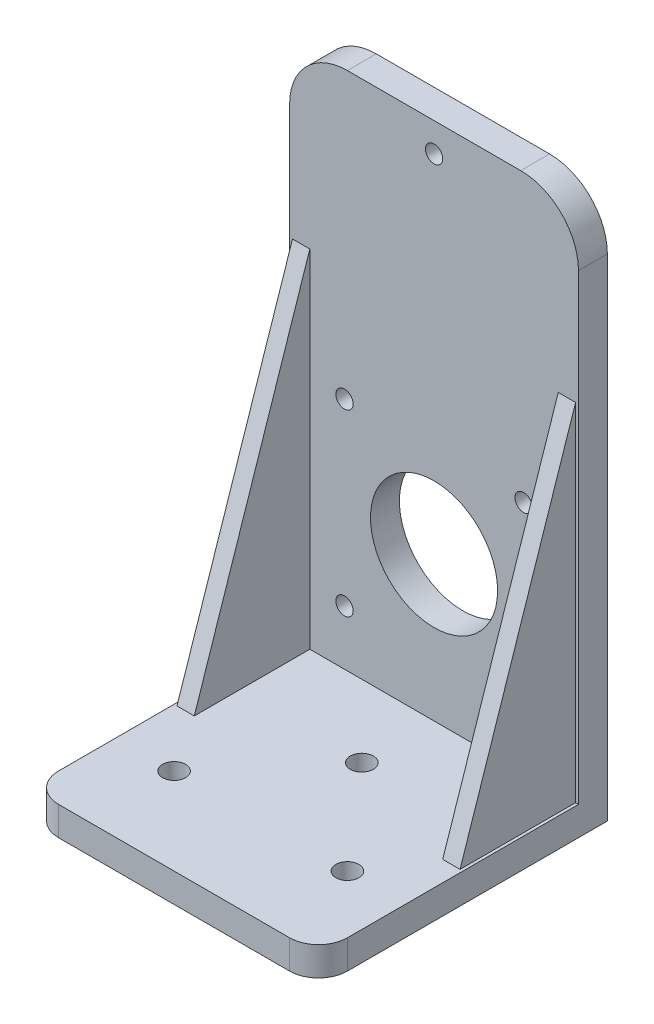
ISO-10303-21;
HEADER;
FILE_DESCRIPTION(('STEP AP214'),'2;1');
FILE_NAME('part.step','',(''),(''),'','','');
FILE_SCHEMA(('AUTOMOTIVE_DESIGN { 1 0 10303 214 1 1 1 1 }'));
ENDSEC;
DATA;
#1=APPLICATION_CONTEXT('core data for automotive mechanical design processes');
#2=APPLICATION_PROTOCOL_DEFINITION('international standard','automotive_design',2000,#1);
#3=PRODUCT_CONTEXT('',#1,'mechanical');
#4=PRODUCT('Part','Part','',(#3));
#5=PRODUCT_RELATED_PRODUCT_CATEGORY('part','',(#4));
#6=PRODUCT_DEFINITION_FORMATION('','',#4);
#7=PRODUCT_DEFINITION_CONTEXT('part definition',#1,'design');
#8=PRODUCT_DEFINITION('design','',#6,#7);
#9=PRODUCT_DEFINITION_SHAPE('','',#8);
#10=(LENGTH_UNIT() NAMED_UNIT(*) SI_UNIT(.MILLI.,.METRE.));
#11=(NAMED_UNIT(*) PLANE_ANGLE_UNIT() SI_UNIT($,.RADIAN.));
#12=(NAMED_UNIT(*) SI_UNIT($,.STERADIAN.) SOLID_ANGLE_UNIT());
#13=UNCERTAINTY_MEASURE_WITH_UNIT(LENGTH_MEASURE(1.E-05),#10,'distance_accuracy_value','');
#14=(GEOMETRIC_REPRESENTATION_CONTEXT(3) GLOBAL_UNCERTAINTY_ASSIGNED_CONTEXT((#13)) GLOBAL_UNIT_ASSIGNED_CONTEXT((#10,
#11,#12)) REPRESENTATION_CONTEXT('',''));
#15=CARTESIAN_POINT('',(0.,0.,0.));
#16=DIRECTION('',(0.,0.,1.));
#17=DIRECTION('',(1.,0.,0.));
#18=AXIS2_PLACEMENT_3D('',#15,#16,#17);
#19=CARTESIAN_POINT('',(-20.,20.,5.));
#20=DIRECTION('',(0.,0.,1.));
#21=DIRECTION('',(1.,0.,0.));
#22=AXIS2_PLACEMENT_3D('',#19,#20,#21);
#23=PLANE('',#22);
#24=DIRECTION('',(0.,-1.,0.));
#25=VECTOR('',#24,1.);
#26=CARTESIAN_POINT('',(21.5,35.,5.));
#27=LINE('',#26,#25);
#28=CARTESIAN_POINT('',(21.5,35.,5.));
#29=VERTEX_POINT('',#28);
#30=CARTESIAN_POINT('',(21.5,-25.,5.));
#31=VERTEX_POINT('',#30);
#32=EDGE_CURVE('E51',#29,#31,#27,.T.);
#33=ORIENTED_EDGE('',*,*,#32,.F.);
#34=DIRECTION('',(1.,0.,0.));
#35=VECTOR('',#34,1.);
#36=CARTESIAN_POINT('',(21.5,35.,5.));
#37=LINE('',#36,#35);
#38=CARTESIAN_POINT('',(24.5,35.,5.));
#39=VERTEX_POINT('',#38);
#40=EDGE_CURVE('E56',#29,#39,#37,.T.);
#41=ORIENTED_EDGE('',*,*,#40,.T.);
#42=DIRECTION('',(0.,-1.,0.));
#43=VECTOR('',#42,1.);
#44=CARTESIAN_POINT('',(24.5,35.,5.));
#45=LINE('',#44,#43);
#46=CARTESIAN_POINT('',(24.5,-25.,5.));
#47=VERTEX_POINT('',#46);
#48=EDGE_CURVE('E161',#39,#47,#45,.T.);
#49=ORIENTED_EDGE('',*,*,#48,.T.);
#50=DIRECTION('',(-1.,0.,0.));
#51=VECTOR('',#50,1.);
#52=CARTESIAN_POINT('',(-25.,-25.,5.));
#53=LINE('',#52,#51);
#54=CARTESIAN_POINT('',(25.,-25.,5.));
#55=VERTEX_POINT('',#54);
#56=EDGE_CURVE('E148',#55,#47,#53,.T.);
#57=ORIENTED_EDGE('',*,*,#56,.F.);
#58=DIRECTION('',(0.,1.,0.));
#59=VECTOR('',#58,1.);
#60=CARTESIAN_POINT('',(25.,20.,5.));
#61=LINE('',#60,#59);
#62=CARTESIAN_POINT('',(25.,55.,5.));
#63=VERTEX_POINT('',#62);
#64=EDGE_CURVE('E284',#55,#63,#61,.T.);
#65=ORIENTED_EDGE('',*,*,#64,.T.);
#66=CARTESIAN_POINT('',(15.,55.,5.));
#67=DIRECTION('',(0.,0.,-1.));
#68=DIRECTION('',(-1.,0.,0.));
#69=AXIS2_PLACEMENT_3D('',#66,#67,#68);
#70=CIRCLE('',#69,10.);
#71=CARTESIAN_POINT('',(15.,65.,5.));
#72=VERTEX_POINT('',#71);
#73=EDGE_CURVE('E214',#63,#72,#70,.F.);
#74=ORIENTED_EDGE('',*,*,#73,.T.);
#75=DIRECTION('',(-1.,0.,0.));
#76=VECTOR('',#75,1.);
#77=CARTESIAN_POINT('',(0.,65.,5.));
#78=LINE('',#77,#76);
#79=CARTESIAN_POINT('',(-15.,65.,5.));
#80=VERTEX_POINT('',#79);
#81=EDGE_CURVE('E212',#72,#80,#78,.T.);
#82=ORIENTED_EDGE('',*,*,#81,.T.);
#83=CARTESIAN_POINT('',(-15.,55.,5.));
#84=DIRECTION('',(0.,0.,-1.));
#85=DIRECTION('',(-1.,0.,0.));
#86=AXIS2_PLACEMENT_3D('',#83,#84,#85);
#87=CIRCLE('',#86,10.);
#88=CARTESIAN_POINT('',(-25.,55.,5.));
#89=VERTEX_POINT('',#88);
#90=EDGE_CURVE('E208',#80,#89,#87,.F.);
#91=ORIENTED_EDGE('',*,*,#90,.T.);
#92=DIRECTION('',(0.,-1.,0.));
#93=VECTOR('',#92,1.);
#94=CARTESIAN_POINT('',(-25.,20.,5.));
#95=LINE('',#94,#93);
#96=CARTESIAN_POINT('',(-25.,-25.,5.));
#97=VERTEX_POINT('',#96);
#98=EDGE_CURVE('E286',#89,#97,#95,.T.);
#99=ORIENTED_EDGE('',*,*,#98,.T.);
#100=CARTESIAN_POINT('',(-24.5,-25.,5.));
#101=VERTEX_POINT('',#100);
#102=EDGE_CURVE('E159',#101,#97,#53,.T.);
#103=ORIENTED_EDGE('',*,*,#102,.F.);
#104=DIRECTION('',(0.,-1.,0.));
#105=VECTOR('',#104,1.);
#106=CARTESIAN_POINT('',(-24.5,35.,5.));
#107=LINE('',#106,#105);
#108=CARTESIAN_POINT('',(-24.5,35.,5.));
#109=VERTEX_POINT('',#108);
#110=EDGE_CURVE('E186',#109,#101,#107,.T.);
#111=ORIENTED_EDGE('',*,*,#110,.F.);
#112=DIRECTION('',(-1.,0.,0.));
#113=VECTOR('',#112,1.);
#114=CARTESIAN_POINT('',(-21.5,35.,5.));
#115=LINE('',#114,#113);
#116=CARTESIAN_POINT('',(-21.5,35.,5.));
#117=VERTEX_POINT('',#116);
#118=EDGE_CURVE('E200',#117,#109,#115,.T.);
#119=ORIENTED_EDGE('',*,*,#118,.F.);
#120=DIRECTION('',(0.,-1.,0.));
#121=VECTOR('',#120,1.);
#122=CARTESIAN_POINT('',(-21.5,35.,5.));
#123=LINE('',#122,#121);
#124=CARTESIAN_POINT('',(-21.5,-25.,5.));
#125=VERTEX_POINT('',#124);
#126=EDGE_CURVE('E189',#117,#125,#123,.T.);
#127=ORIENTED_EDGE('',*,*,#126,.T.);
#128=EDGE_CURVE('E157',#31,#125,#53,.T.);
#129=ORIENTED_EDGE('',*,*,#128,.F.);
#130=EDGE_LOOP('',(#33,#41,#49,#57,#65,#74,#82,#91,#99,#103,#111,#119,#127,#129));
#131=FACE_BOUND('',#130,.T.);
#132=CARTESIAN_POINT('',(-15.5000000000001,-15.5,5.));
#133=DIRECTION('',(0.,0.,1.));
#134=DIRECTION('',(1.,0.,0.));
#135=AXIS2_PLACEMENT_3D('',#132,#133,#134);
#136=CIRCLE('',#135,1.5);
#137=CARTESIAN_POINT('',(-14.0000000000001,-15.5,5.));
#138=VERTEX_POINT('',#137);
#139=EDGE_CURVE('E228',#138,#138,#136,.T.);
#140=ORIENTED_EDGE('',*,*,#139,.F.);
#141=EDGE_LOOP('',(#140));
#142=FACE_BOUND('',#141,.T.);
#143=CARTESIAN_POINT('',(15.4999999999999,-15.5,5.));
#144=DIRECTION('',(0.,0.,1.));
#145=DIRECTION('',(1.,0.,0.));
#146=AXIS2_PLACEMENT_3D('',#143,#144,#145);
#147=CIRCLE('',#146,1.5);
#148=CARTESIAN_POINT('',(16.9999999999999,-15.5,5.));
#149=VERTEX_POINT('',#148);
#150=EDGE_CURVE('E247',#149,#149,#147,.T.);
#151=ORIENTED_EDGE('',*,*,#150,.F.);
#152=EDGE_LOOP('',(#151));
#153=FACE_BOUND('',#152,.T.);
#154=CARTESIAN_POINT('',(15.4999999999999,15.5,5.));
#155=DIRECTION('',(0.,0.,1.));
#156=DIRECTION('',(1.,0.,0.));
#157=AXIS2_PLACEMENT_3D('',#154,#155,#156);
#158=CIRCLE('',#157,1.5);
#159=CARTESIAN_POINT('',(16.9999999999999,15.5,5.));
#160=VERTEX_POINT('',#159);
#161=EDGE_CURVE('E241',#160,#160,#158,.T.);
#162=ORIENTED_EDGE('',*,*,#161,.F.);
#163=EDGE_LOOP('',(#162));
#164=FACE_BOUND('',#163,.T.);
#165=CARTESIAN_POINT('',(-15.5000000000001,15.5,5.));
#166=DIRECTION('',(0.,0.,1.));
#167=DIRECTION('',(1.,0.,0.));
#168=AXIS2_PLACEMENT_3D('',#165,#166,#167);
#169=CIRCLE('',#168,1.5);
#170=CARTESIAN_POINT('',(-14.0000000000001,15.5,5.));
#171=VERTEX_POINT('',#170);
#172=EDGE_CURVE('E240',#171,#171,#169,.T.);
#173=ORIENTED_EDGE('',*,*,#172,.F.);
#174=EDGE_LOOP('',(#173));
#175=FACE_BOUND('',#174,.T.);
#176=CARTESIAN_POINT('',(0.,0.,5.));
#177=DIRECTION('',(0.,0.,1.));
#178=DIRECTION('',(1.,0.,0.));
#179=AXIS2_PLACEMENT_3D('',#176,#177,#178);
#180=CIRCLE('',#179,11.);
#181=CARTESIAN_POINT('',(11.,0.,5.));
#182=VERTEX_POINT('',#181);
#183=EDGE_CURVE('E278',#182,#182,#180,.T.);
#184=ORIENTED_EDGE('',*,*,#183,.F.);
#185=EDGE_LOOP('',(#184));
#186=FACE_BOUND('',#185,.T.);
#187=CARTESIAN_POINT('',(0.,60.,5.));
#188=DIRECTION('',(0.,0.,-1.));
#189=DIRECTION('',(-1.,0.,0.));
#190=AXIS2_PLACEMENT_3D('',#187,#188,#189);
#191=CIRCLE('',#190,1.5);
#192=CARTESIAN_POINT('',(-1.5,60.,5.));
#193=VERTEX_POINT('',#192);
#194=EDGE_CURVE('E205',#193,#193,#191,.T.);
#195=ORIENTED_EDGE('',*,*,#194,.T.);
#196=EDGE_LOOP('',(#195));
#197=FACE_BOUND('',#196,.T.);
#198=ADVANCED_FACE('F36',(#131,#142,#153,#164,#175,#186,#197),#23,.T.);
#199=CARTESIAN_POINT('',(-20.,20.,0.));
#200=DIRECTION('',(0.,0.,1.));
#201=DIRECTION('',(1.,0.,0.));
#202=AXIS2_PLACEMENT_3D('',#199,#200,#201);
#203=PLANE('',#202);
#204=CARTESIAN_POINT('',(-15.5000000000001,-15.5,0.));
#205=DIRECTION('',(0.,0.,1.));
#206=DIRECTION('',(1.,0.,0.));
#207=AXIS2_PLACEMENT_3D('',#204,#205,#206);
#208=CIRCLE('',#207,1.5);
#209=CARTESIAN_POINT('',(-14.0000000000001,-15.5,0.));
#210=VERTEX_POINT('',#209);
#211=EDGE_CURVE('E250',#210,#210,#208,.T.);
#212=ORIENTED_EDGE('',*,*,#211,.T.);
#213=EDGE_LOOP('',(#212));
#214=FACE_BOUND('',#213,.T.);
#215=CARTESIAN_POINT('',(15.4999999999999,-15.5,0.));
#216=DIRECTION('',(0.,0.,1.));
#217=DIRECTION('',(1.,0.,0.));
#218=AXIS2_PLACEMENT_3D('',#215,#216,#217);
#219=CIRCLE('',#218,1.5);
#220=CARTESIAN_POINT('',(16.9999999999999,-15.5,0.));
#221=VERTEX_POINT('',#220);
#222=EDGE_CURVE('E244',#221,#221,#219,.T.);
#223=ORIENTED_EDGE('',*,*,#222,.T.);
#224=EDGE_LOOP('',(#223));
#225=FACE_BOUND('',#224,.T.);
#226=CARTESIAN_POINT('',(15.4999999999999,15.5,0.));
#227=DIRECTION('',(0.,0.,1.));
#228=DIRECTION('',(1.,0.,0.));
#229=AXIS2_PLACEMENT_3D('',#226,#227,#228);
#230=CIRCLE('',#229,1.5);
#231=CARTESIAN_POINT('',(16.9999999999999,15.5,0.));
#232=VERTEX_POINT('',#231);
#233=EDGE_CURVE('E237',#232,#232,#230,.T.);
#234=ORIENTED_EDGE('',*,*,#233,.T.);
#235=EDGE_LOOP('',(#234));
#236=FACE_BOUND('',#235,.T.);
#237=CARTESIAN_POINT('',(-15.5000000000001,15.5,0.));
#238=DIRECTION('',(0.,0.,1.));
#239=DIRECTION('',(1.,0.,0.));
#240=AXIS2_PLACEMENT_3D('',#237,#238,#239);
#241=CIRCLE('',#240,1.5);
#242=CARTESIAN_POINT('',(-14.0000000000001,15.5,0.));
#243=VERTEX_POINT('',#242);
#244=EDGE_CURVE('E255',#243,#243,#241,.T.);
#245=ORIENTED_EDGE('',*,*,#244,.T.);
#246=EDGE_LOOP('',(#245));
#247=FACE_BOUND('',#246,.T.);
#248=DIRECTION('',(0.,1.,0.));
#249=VECTOR('',#248,1.);
#250=CARTESIAN_POINT('',(25.,20.,0.));
#251=LINE('',#250,#249);
#252=CARTESIAN_POINT('',(25.,-30.,0.));
#253=VERTEX_POINT('',#252);
#254=CARTESIAN_POINT('',(25.,55.,0.));
#255=VERTEX_POINT('',#254);
#256=EDGE_CURVE('E281',#253,#255,#251,.T.);
#257=ORIENTED_EDGE('',*,*,#256,.F.);
#258=DIRECTION('',(1.,0.,0.));
#259=VECTOR('',#258,1.);
#260=CARTESIAN_POINT('',(-25.,-30.,0.));
#261=LINE('',#260,#259);
#262=CARTESIAN_POINT('',(-25.,-30.,0.));
#263=VERTEX_POINT('',#262);
#264=EDGE_CURVE('E271',#263,#253,#261,.T.);
#265=ORIENTED_EDGE('',*,*,#264,.F.);
#266=DIRECTION('',(0.,-1.,0.));
#267=VECTOR('',#266,1.);
#268=CARTESIAN_POINT('',(-25.,20.,0.));
#269=LINE('',#268,#267);
#270=CARTESIAN_POINT('',(-25.,55.,0.));
#271=VERTEX_POINT('',#270);
#272=EDGE_CURVE('E287',#271,#263,#269,.T.);
#273=ORIENTED_EDGE('',*,*,#272,.F.);
#274=CARTESIAN_POINT('',(-15.,55.,0.));
#275=DIRECTION('',(0.,0.,-1.));
#276=DIRECTION('',(-1.,0.,0.));
#277=AXIS2_PLACEMENT_3D('',#274,#275,#276);
#278=CIRCLE('',#277,10.);
#279=CARTESIAN_POINT('',(-15.,65.,0.));
#280=VERTEX_POINT('',#279);
#281=EDGE_CURVE('E219',#280,#271,#278,.F.);
#282=ORIENTED_EDGE('',*,*,#281,.F.);
#283=DIRECTION('',(-1.,0.,0.));
#284=VECTOR('',#283,1.);
#285=CARTESIAN_POINT('',(0.,65.,0.));
#286=LINE('',#285,#284);
#287=CARTESIAN_POINT('',(15.,65.,0.));
#288=VERTEX_POINT('',#287);
#289=EDGE_CURVE('E222',#288,#280,#286,.T.);
#290=ORIENTED_EDGE('',*,*,#289,.F.);
#291=CARTESIAN_POINT('',(15.,55.,0.));
#292=DIRECTION('',(0.,0.,-1.));
#293=DIRECTION('',(-1.,0.,0.));
#294=AXIS2_PLACEMENT_3D('',#291,#292,#293);
#295=CIRCLE('',#294,10.);
#296=EDGE_CURVE('E209',#255,#288,#295,.F.);
#297=ORIENTED_EDGE('',*,*,#296,.F.);
#298=EDGE_LOOP('',(#257,#265,#273,#282,#290,#297));
#299=FACE_BOUND('',#298,.T.);
#300=CARTESIAN_POINT('',(0.,0.,0.));
#301=DIRECTION('',(0.,0.,1.));
#302=DIRECTION('',(1.,0.,0.));
#303=AXIS2_PLACEMENT_3D('',#300,#301,#302);
#304=CIRCLE('',#303,11.);
#305=CARTESIAN_POINT('',(11.,0.,0.));
#306=VERTEX_POINT('',#305);
#307=EDGE_CURVE('E277',#306,#306,#304,.T.);
#308=ORIENTED_EDGE('',*,*,#307,.T.);
#309=EDGE_LOOP('',(#308));
#310=FACE_BOUND('',#309,.T.);
#311=CARTESIAN_POINT('',(0.,60.,0.));
#312=DIRECTION('',(0.,0.,-1.));
#313=DIRECTION('',(-1.,0.,0.));
#314=AXIS2_PLACEMENT_3D('',#311,#312,#313);
#315=CIRCLE('',#314,1.5);
#316=CARTESIAN_POINT('',(-1.5,60.,0.));
#317=VERTEX_POINT('',#316);
#318=EDGE_CURVE('E203',#317,#317,#315,.T.);
#319=ORIENTED_EDGE('',*,*,#318,.F.);
#320=EDGE_LOOP('',(#319));
#321=FACE_BOUND('',#320,.T.);
#322=ADVANCED_FACE('F326',(#214,#225,#236,#247,#299,#310,#321),#203,.F.);
#323=CARTESIAN_POINT('',(25.,20.,5.));
#324=DIRECTION('',(-1.,0.,0.));
#325=DIRECTION('',(0.,-1.,0.));
#326=AXIS2_PLACEMENT_3D('',#323,#324,#325);
#327=PLANE('',#326);
#328=DIRECTION('',(0.,0.,-1.));
#329=VECTOR('',#328,1.);
#330=CARTESIAN_POINT('',(25.,-25.,50.));
#331=LINE('',#330,#329);
#332=CARTESIAN_POINT('',(25.,-25.,45.));
#333=VERTEX_POINT('',#332);
#334=EDGE_CURVE('E154',#333,#55,#331,.T.);
#335=ORIENTED_EDGE('',*,*,#334,.F.);
#336=DIRECTION('',(0.,1.,0.));
#337=VECTOR('',#336,1.);
#338=CARTESIAN_POINT('',(25.,-30.,45.));
#339=LINE('',#338,#337);
#340=CARTESIAN_POINT('',(25.,-30.,45.));
#341=VERTEX_POINT('',#340);
#342=EDGE_CURVE('E11',#333,#341,#339,.F.);
#343=ORIENTED_EDGE('',*,*,#342,.T.);
#344=DIRECTION('',(0.,0.,1.));
#345=VECTOR('',#344,1.);
#346=CARTESIAN_POINT('',(25.,-30.,0.));
#347=LINE('',#346,#345);
#348=EDGE_CURVE('E274',#253,#341,#347,.T.);
#349=ORIENTED_EDGE('',*,*,#348,.F.);
#350=ORIENTED_EDGE('',*,*,#256,.T.);
#351=DIRECTION('',(0.,0.,-1.));
#352=VECTOR('',#351,1.);
#353=CARTESIAN_POINT('',(25.,55.,5.));
#354=LINE('',#353,#352);
#355=EDGE_CURVE('E229',#63,#255,#354,.T.);
#356=ORIENTED_EDGE('',*,*,#355,.F.);
#357=ORIENTED_EDGE('',*,*,#64,.F.);
#358=EDGE_LOOP('',(#335,#343,#349,#350,#356,#357));
#359=FACE_BOUND('',#358,.T.);
#360=ADVANCED_FACE('F332',(#359),#327,.F.);
#361=CARTESIAN_POINT('',(-25.,20.,5.));
#362=DIRECTION('',(1.,0.,0.));
#363=DIRECTION('',(0.,1.,0.));
#364=AXIS2_PLACEMENT_3D('',#361,#362,#363);
#365=PLANE('',#364);
#366=DIRECTION('',(0.,0.,-1.));
#367=VECTOR('',#366,1.);
#368=CARTESIAN_POINT('',(-25.,-30.,5.));
#369=LINE('',#368,#367);
#370=CARTESIAN_POINT('',(-25.,-30.,45.));
#371=VERTEX_POINT('',#370);
#372=EDGE_CURVE('E269',#371,#263,#369,.T.);
#373=ORIENTED_EDGE('',*,*,#372,.F.);
#374=DIRECTION('',(0.,-1.,0.));
#375=VECTOR('',#374,1.);
#376=CARTESIAN_POINT('',(-25.,-25.,45.));
#377=LINE('',#376,#375);
#378=CARTESIAN_POINT('',(-25.,-25.,45.));
#379=VERTEX_POINT('',#378);
#380=EDGE_CURVE('E303',#371,#379,#377,.F.);
#381=ORIENTED_EDGE('',*,*,#380,.T.);
#382=DIRECTION('',(0.,0.,-1.));
#383=VECTOR('',#382,1.);
#384=CARTESIAN_POINT('',(-25.,-25.,50.));
#385=LINE('',#384,#383);
#386=EDGE_CURVE('E264',#379,#97,#385,.T.);
#387=ORIENTED_EDGE('',*,*,#386,.T.);
#388=ORIENTED_EDGE('',*,*,#98,.F.);
#389=DIRECTION('',(0.,0.,-1.));
#390=VECTOR('',#389,1.);
#391=CARTESIAN_POINT('',(-25.,55.,5.));
#392=LINE('',#391,#390);
#393=EDGE_CURVE('E225',#89,#271,#392,.T.);
#394=ORIENTED_EDGE('',*,*,#393,.T.);
#395=ORIENTED_EDGE('',*,*,#272,.T.);
#396=EDGE_LOOP('',(#373,#381,#387,#388,#394,#395));
#397=FACE_BOUND('',#396,.T.);
#398=ADVANCED_FACE('F321',(#397),#365,.F.);
#399=CARTESIAN_POINT('',(0.,0.,5.));
#400=DIRECTION('',(0.,0.,-1.));
#401=DIRECTION('',(-1.,0.,0.));
#402=AXIS2_PLACEMENT_3D('',#399,#400,#401);
#403=CYLINDRICAL_SURFACE('',#402,11.);
#404=ORIENTED_EDGE('',*,*,#183,.T.);
#405=EDGE_LOOP('',(#404));
#406=FACE_BOUND('',#405,.T.);
#407=ORIENTED_EDGE('',*,*,#307,.F.);
#408=EDGE_LOOP('',(#407));
#409=FACE_BOUND('',#408,.T.);
#410=ADVANCED_FACE('F354',(#406,#409),#403,.F.);
#411=CARTESIAN_POINT('',(0.,-30.,0.));
#412=DIRECTION('',(0.,-1.,0.));
#413=DIRECTION('',(0.,0.,-1.));
#414=AXIS2_PLACEMENT_3D('',#411,#412,#413);
#415=PLANE('',#414);
#416=CARTESIAN_POINT('',(-15.,-30.,35.));
#417=DIRECTION('',(0.,1.,0.));
#418=DIRECTION('',(0.,0.,1.));
#419=AXIS2_PLACEMENT_3D('',#416,#417,#418);
#420=CIRCLE('',#419,2.);
#421=CARTESIAN_POINT('',(-15.,-30.,37.));
#422=VERTEX_POINT('',#421);
#423=EDGE_CURVE('E168',#422,#422,#420,.T.);
#424=ORIENTED_EDGE('',*,*,#423,.T.);
#425=EDGE_LOOP('',(#424));
#426=FACE_BOUND('',#425,.T.);
#427=CARTESIAN_POINT('',(15.,-30.,35.));
#428=DIRECTION('',(0.,1.,0.));
#429=DIRECTION('',(0.,0.,-1.));
#430=AXIS2_PLACEMENT_3D('',#427,#428,#429);
#431=CIRCLE('',#430,2.);
#432=CARTESIAN_POINT('',(15.,-30.,33.));
#433=VERTEX_POINT('',#432);
#434=EDGE_CURVE('E589',#433,#433,#431,.T.);
#435=ORIENTED_EDGE('',*,*,#434,.T.);
#436=EDGE_LOOP('',(#435));
#437=FACE_BOUND('',#436,.T.);
#438=CARTESIAN_POINT('',(0.,-30.,17.5));
#439=DIRECTION('',(0.,1.,0.));
#440=DIRECTION('',(0.,0.,1.));
#441=AXIS2_PLACEMENT_3D('',#438,#439,#440);
#442=CIRCLE('',#441,2.);
#443=CARTESIAN_POINT('',(0.,-30.,19.5));
#444=VERTEX_POINT('',#443);
#445=EDGE_CURVE('E597',#444,#444,#442,.T.);
#446=ORIENTED_EDGE('',*,*,#445,.T.);
#447=EDGE_LOOP('',(#446));
#448=FACE_BOUND('',#447,.T.);
#449=DIRECTION('',(1.,0.,0.));
#450=VECTOR('',#449,1.);
#451=CARTESIAN_POINT('',(-25.,-30.,50.));
#452=LINE('',#451,#450);
#453=CARTESIAN_POINT('',(-20.,-30.,50.));
#454=VERTEX_POINT('',#453);
#455=CARTESIAN_POINT('',(20.,-30.,50.));
#456=VERTEX_POINT('',#455);
#457=EDGE_CURVE('E156',#454,#456,#452,.T.);
#458=ORIENTED_EDGE('',*,*,#457,.F.);
#459=CARTESIAN_POINT('',(-20.,-30.,45.));
#460=DIRECTION('',(0.,-1.,0.));
#461=DIRECTION('',(0.,0.,-1.));
#462=AXIS2_PLACEMENT_3D('',#459,#460,#461);
#463=CIRCLE('',#462,5.);
#464=EDGE_CURVE('E301',#454,#371,#463,.T.);
#465=ORIENTED_EDGE('',*,*,#464,.T.);
#466=ORIENTED_EDGE('',*,*,#372,.T.);
#467=ORIENTED_EDGE('',*,*,#264,.T.);
#468=ORIENTED_EDGE('',*,*,#348,.T.);
#469=CARTESIAN_POINT('',(20.,-30.,45.));
#470=DIRECTION('',(0.,-1.,0.));
#471=DIRECTION('',(0.,0.,-1.));
#472=AXIS2_PLACEMENT_3D('',#469,#470,#471);
#473=CIRCLE('',#472,5.);
#474=EDGE_CURVE('E299',#341,#456,#473,.T.);
#475=ORIENTED_EDGE('',*,*,#474,.T.);
#476=EDGE_LOOP('',(#458,#465,#466,#467,#468,#475));
#477=FACE_BOUND('',#476,.T.);
#478=ADVANCED_FACE('F319',(#426,#437,#448,#477),#415,.T.);
#479=CARTESIAN_POINT('',(-25.,-25.,50.));
#480=DIRECTION('',(0.,-1.,0.));
#481=DIRECTION('',(0.,0.,-1.));
#482=AXIS2_PLACEMENT_3D('',#479,#480,#481);
#483=PLANE('',#482);
#484=CARTESIAN_POINT('',(-15.,-25.,35.));
#485=DIRECTION('',(0.,1.,0.));
#486=DIRECTION('',(0.,0.,1.));
#487=AXIS2_PLACEMENT_3D('',#484,#485,#486);
#488=CIRCLE('',#487,2.);
#489=CARTESIAN_POINT('',(-15.,-25.,37.));
#490=VERTEX_POINT('',#489);
#491=EDGE_CURVE('E171',#490,#490,#488,.T.);
#492=ORIENTED_EDGE('',*,*,#491,.F.);
#493=EDGE_LOOP('',(#492));
#494=FACE_BOUND('',#493,.T.);
#495=CARTESIAN_POINT('',(15.,-25.,35.));
#496=DIRECTION('',(0.,1.,0.));
#497=DIRECTION('',(0.,0.,-1.));
#498=AXIS2_PLACEMENT_3D('',#495,#496,#497);
#499=CIRCLE('',#498,2.);
#500=CARTESIAN_POINT('',(15.,-25.,33.));
#501=VERTEX_POINT('',#500);
#502=EDGE_CURVE('E592',#501,#501,#499,.T.);
#503=ORIENTED_EDGE('',*,*,#502,.F.);
#504=EDGE_LOOP('',(#503));
#505=FACE_BOUND('',#504,.T.);
#506=CARTESIAN_POINT('',(0.,-25.,17.5));
#507=DIRECTION('',(0.,1.,0.));
#508=DIRECTION('',(0.,0.,1.));
#509=AXIS2_PLACEMENT_3D('',#506,#507,#508);
#510=CIRCLE('',#509,2.);
#511=CARTESIAN_POINT('',(0.,-25.,19.5));
#512=VERTEX_POINT('',#511);
#513=EDGE_CURVE('E600',#512,#512,#510,.T.);
#514=ORIENTED_EDGE('',*,*,#513,.F.);
#515=EDGE_LOOP('',(#514));
#516=FACE_BOUND('',#515,.T.);
#517=DIRECTION('',(1.,0.,0.));
#518=VECTOR('',#517,1.);
#519=CARTESIAN_POINT('',(21.5,-25.,25.));
#520=LINE('',#519,#518);
#521=CARTESIAN_POINT('',(21.5,-25.,25.));
#522=VERTEX_POINT('',#521);
#523=CARTESIAN_POINT('',(24.5,-25.,25.));
#524=VERTEX_POINT('',#523);
#525=EDGE_CURVE('E179',#522,#524,#520,.T.);
#526=ORIENTED_EDGE('',*,*,#525,.F.);
#527=DIRECTION('',(0.,0.,1.));
#528=VECTOR('',#527,1.);
#529=CARTESIAN_POINT('',(21.5,-25.,5.));
#530=LINE('',#529,#528);
#531=EDGE_CURVE('E178',#31,#522,#530,.T.);
#532=ORIENTED_EDGE('',*,*,#531,.F.);
#533=ORIENTED_EDGE('',*,*,#128,.T.);
#534=DIRECTION('',(0.,0.,1.));
#535=VECTOR('',#534,1.);
#536=CARTESIAN_POINT('',(-21.5,-25.,5.));
#537=LINE('',#536,#535);
#538=CARTESIAN_POINT('',(-21.5,-25.,25.));
#539=VERTEX_POINT('',#538);
#540=EDGE_CURVE('E183',#125,#539,#537,.T.);
#541=ORIENTED_EDGE('',*,*,#540,.T.);
#542=DIRECTION('',(-1.,0.,0.));
#543=VECTOR('',#542,1.);
#544=CARTESIAN_POINT('',(-21.5,-25.,25.));
#545=LINE('',#544,#543);
#546=CARTESIAN_POINT('',(-24.5,-25.,25.));
#547=VERTEX_POINT('',#546);
#548=EDGE_CURVE('E192',#539,#547,#545,.T.);
#549=ORIENTED_EDGE('',*,*,#548,.T.);
#550=DIRECTION('',(0.,0.,1.));
#551=VECTOR('',#550,1.);
#552=CARTESIAN_POINT('',(-24.5,-25.,5.));
#553=LINE('',#552,#551);
#554=EDGE_CURVE('E181',#101,#547,#553,.T.);
#555=ORIENTED_EDGE('',*,*,#554,.F.);
#556=ORIENTED_EDGE('',*,*,#102,.T.);
#557=ORIENTED_EDGE('',*,*,#386,.F.);
#558=CARTESIAN_POINT('',(-20.,-25.,45.));
#559=DIRECTION('',(0.,-1.,0.));
#560=DIRECTION('',(0.,0.,-1.));
#561=AXIS2_PLACEMENT_3D('',#558,#559,#560);
#562=CIRCLE('',#561,5.);
#563=CARTESIAN_POINT('',(-20.,-25.,50.));
#564=VERTEX_POINT('',#563);
#565=EDGE_CURVE('E44',#379,#564,#562,.F.);
#566=ORIENTED_EDGE('',*,*,#565,.T.);
#567=DIRECTION('',(-1.,0.,0.));
#568=VECTOR('',#567,1.);
#569=CARTESIAN_POINT('',(-25.,-25.,50.));
#570=LINE('',#569,#568);
#571=CARTESIAN_POINT('',(20.,-25.,50.));
#572=VERTEX_POINT('',#571);
#573=EDGE_CURVE('E262',#572,#564,#570,.T.);
#574=ORIENTED_EDGE('',*,*,#573,.F.);
#575=CARTESIAN_POINT('',(20.,-25.,45.));
#576=DIRECTION('',(0.,-1.,0.));
#577=DIRECTION('',(0.,0.,-1.));
#578=AXIS2_PLACEMENT_3D('',#575,#576,#577);
#579=CIRCLE('',#578,5.);
#580=EDGE_CURVE('E305',#572,#333,#579,.F.);
#581=ORIENTED_EDGE('',*,*,#580,.T.);
#582=ORIENTED_EDGE('',*,*,#334,.T.);
#583=ORIENTED_EDGE('',*,*,#56,.T.);
#584=DIRECTION('',(0.,0.,1.));
#585=VECTOR('',#584,1.);
#586=CARTESIAN_POINT('',(24.5,-25.,5.));
#587=LINE('',#586,#585);
#588=EDGE_CURVE('E151',#47,#524,#587,.T.);
#589=ORIENTED_EDGE('',*,*,#588,.T.);
#590=EDGE_LOOP('',(#526,#532,#533,#541,#549,#555,#556,#557,#566,#574,#581,#582,#583,#589));
#591=FACE_BOUND('',#590,.T.);
#592=ADVANCED_FACE('F149',(#494,#505,#516,#591),#483,.F.);
#593=CARTESIAN_POINT('',(0.,0.,50.));
#594=DIRECTION('',(0.,0.,1.));
#595=DIRECTION('',(1.,0.,0.));
#596=AXIS2_PLACEMENT_3D('',#593,#594,#595);
#597=PLANE('',#596);
#598=ORIENTED_EDGE('',*,*,#573,.T.);
#599=DIRECTION('',(0.,-1.,0.));
#600=VECTOR('',#599,1.);
#601=CARTESIAN_POINT('',(-20.,-30.,50.));
#602=LINE('',#601,#600);
#603=EDGE_CURVE('E296',#564,#454,#602,.T.);
#604=ORIENTED_EDGE('',*,*,#603,.T.);
#605=ORIENTED_EDGE('',*,*,#457,.T.);
#606=DIRECTION('',(0.,1.,0.));
#607=VECTOR('',#606,1.);
#608=CARTESIAN_POINT('',(20.,-25.,50.));
#609=LINE('',#608,#607);
#610=EDGE_CURVE('E290',#456,#572,#609,.T.);
#611=ORIENTED_EDGE('',*,*,#610,.T.);
#612=EDGE_LOOP('',(#598,#604,#605,#611));
#613=FACE_BOUND('',#612,.T.);
#614=ADVANCED_FACE('F313',(#613),#597,.T.);
#615=CARTESIAN_POINT('',(-15.5000000000001,15.5,0.));
#616=DIRECTION('',(0.,0.,1.));
#617=DIRECTION('',(1.,0.,0.));
#618=AXIS2_PLACEMENT_3D('',#615,#616,#617);
#619=CYLINDRICAL_SURFACE('',#618,1.5);
#620=ORIENTED_EDGE('',*,*,#244,.F.);
#621=EDGE_LOOP('',(#620));
#622=FACE_BOUND('',#621,.T.);
#623=ORIENTED_EDGE('',*,*,#172,.T.);
#624=EDGE_LOOP('',(#623));
#625=FACE_BOUND('',#624,.T.);
#626=ADVANCED_FACE('F404',(#622,#625),#619,.F.);
#627=CARTESIAN_POINT('',(15.4999999999999,15.5,0.));
#628=DIRECTION('',(0.,0.,1.));
#629=DIRECTION('',(1.,0.,0.));
#630=AXIS2_PLACEMENT_3D('',#627,#628,#629);
#631=CYLINDRICAL_SURFACE('',#630,1.5);
#632=ORIENTED_EDGE('',*,*,#233,.F.);
#633=EDGE_LOOP('',(#632));
#634=FACE_BOUND('',#633,.T.);
#635=ORIENTED_EDGE('',*,*,#161,.T.);
#636=EDGE_LOOP('',(#635));
#637=FACE_BOUND('',#636,.T.);
#638=ADVANCED_FACE('F411',(#634,#637),#631,.F.);
#639=CARTESIAN_POINT('',(15.4999999999999,-15.5,0.));
#640=DIRECTION('',(0.,0.,1.));
#641=DIRECTION('',(1.,0.,0.));
#642=AXIS2_PLACEMENT_3D('',#639,#640,#641);
#643=CYLINDRICAL_SURFACE('',#642,1.5);
#644=ORIENTED_EDGE('',*,*,#222,.F.);
#645=EDGE_LOOP('',(#644));
#646=FACE_BOUND('',#645,.T.);
#647=ORIENTED_EDGE('',*,*,#150,.T.);
#648=EDGE_LOOP('',(#647));
#649=FACE_BOUND('',#648,.T.);
#650=ADVANCED_FACE('F419',(#646,#649),#643,.F.);
#651=CARTESIAN_POINT('',(-15.5000000000001,-15.5,0.));
#652=DIRECTION('',(0.,0.,1.));
#653=DIRECTION('',(1.,0.,0.));
#654=AXIS2_PLACEMENT_3D('',#651,#652,#653);
#655=CYLINDRICAL_SURFACE('',#654,1.5);
#656=ORIENTED_EDGE('',*,*,#211,.F.);
#657=EDGE_LOOP('',(#656));
#658=FACE_BOUND('',#657,.T.);
#659=ORIENTED_EDGE('',*,*,#139,.T.);
#660=EDGE_LOOP('',(#659));
#661=FACE_BOUND('',#660,.T.);
#662=ADVANCED_FACE('F345',(#658,#661),#655,.F.);
#663=CARTESIAN_POINT('',(-20.,0.,45.));
#664=DIRECTION('',(0.,1.,0.));
#665=DIRECTION('',(-1.,0.,0.));
#666=AXIS2_PLACEMENT_3D('',#663,#664,#665);
#667=CYLINDRICAL_SURFACE('',#666,5.);
#668=ORIENTED_EDGE('',*,*,#565,.F.);
#669=ORIENTED_EDGE('',*,*,#380,.F.);
#670=ORIENTED_EDGE('',*,*,#464,.F.);
#671=ORIENTED_EDGE('',*,*,#603,.F.);
#672=EDGE_LOOP('',(#668,#669,#670,#671));
#673=FACE_BOUND('',#672,.T.);
#674=ADVANCED_FACE('F316',(#673),#667,.T.);
#675=CARTESIAN_POINT('',(20.,0.,45.));
#676=DIRECTION('',(0.,-1.,0.));
#677=DIRECTION('',(1.,0.,0.));
#678=AXIS2_PLACEMENT_3D('',#675,#676,#677);
#679=CYLINDRICAL_SURFACE('',#678,5.);
#680=ORIENTED_EDGE('',*,*,#474,.F.);
#681=ORIENTED_EDGE('',*,*,#342,.F.);
#682=ORIENTED_EDGE('',*,*,#580,.F.);
#683=ORIENTED_EDGE('',*,*,#610,.F.);
#684=EDGE_LOOP('',(#680,#681,#682,#683));
#685=FACE_BOUND('',#684,.T.);
#686=ADVANCED_FACE('F38',(#685),#679,.T.);
#687=CARTESIAN_POINT('',(-15.,55.,5.));
#688=DIRECTION('',(0.,0.,-1.));
#689=DIRECTION('',(-1.,0.,0.));
#690=AXIS2_PLACEMENT_3D('',#687,#688,#689);
#691=CYLINDRICAL_SURFACE('',#690,10.);
#692=ORIENTED_EDGE('',*,*,#281,.T.);
#693=ORIENTED_EDGE('',*,*,#393,.F.);
#694=ORIENTED_EDGE('',*,*,#90,.F.);
#695=DIRECTION('',(0.,0.,-1.));
#696=VECTOR('',#695,1.);
#697=CARTESIAN_POINT('',(-15.,65.,5.));
#698=LINE('',#697,#696);
#699=EDGE_CURVE('E216',#80,#280,#698,.T.);
#700=ORIENTED_EDGE('',*,*,#699,.T.);
#701=EDGE_LOOP('',(#692,#693,#694,#700));
#702=FACE_BOUND('',#701,.T.);
#703=ADVANCED_FACE('F337',(#702),#691,.T.);
#704=CARTESIAN_POINT('',(15.,55.,5.));
#705=DIRECTION('',(0.,0.,-1.));
#706=DIRECTION('',(-1.,0.,0.));
#707=AXIS2_PLACEMENT_3D('',#704,#705,#706);
#708=CYLINDRICAL_SURFACE('',#707,10.);
#709=ORIENTED_EDGE('',*,*,#296,.T.);
#710=DIRECTION('',(0.,0.,-1.));
#711=VECTOR('',#710,1.);
#712=CARTESIAN_POINT('',(15.,65.,5.));
#713=LINE('',#712,#711);
#714=EDGE_CURVE('E232',#72,#288,#713,.T.);
#715=ORIENTED_EDGE('',*,*,#714,.F.);
#716=ORIENTED_EDGE('',*,*,#73,.F.);
#717=ORIENTED_EDGE('',*,*,#355,.T.);
#718=EDGE_LOOP('',(#709,#715,#716,#717));
#719=FACE_BOUND('',#718,.T.);
#720=ADVANCED_FACE('F342',(#719),#708,.T.);
#721=CARTESIAN_POINT('',(0.,60.,5.));
#722=DIRECTION('',(0.,0.,-1.));
#723=DIRECTION('',(-1.,0.,0.));
#724=AXIS2_PLACEMENT_3D('',#721,#722,#723);
#725=CYLINDRICAL_SURFACE('',#724,1.5);
#726=ORIENTED_EDGE('',*,*,#194,.F.);
#727=EDGE_LOOP('',(#726));
#728=FACE_BOUND('',#727,.T.);
#729=ORIENTED_EDGE('',*,*,#318,.T.);
#730=EDGE_LOOP('',(#729));
#731=FACE_BOUND('',#730,.T.);
#732=ADVANCED_FACE('F475',(#728,#731),#725,.F.);
#733=CARTESIAN_POINT('',(0.,65.,5.));
#734=DIRECTION('',(0.,-1.,0.));
#735=DIRECTION('',(0.,0.,-1.));
#736=AXIS2_PLACEMENT_3D('',#733,#734,#735);
#737=PLANE('',#736);
#738=ORIENTED_EDGE('',*,*,#289,.T.);
#739=ORIENTED_EDGE('',*,*,#699,.F.);
#740=ORIENTED_EDGE('',*,*,#81,.F.);
#741=ORIENTED_EDGE('',*,*,#714,.T.);
#742=EDGE_LOOP('',(#738,#739,#740,#741));
#743=FACE_BOUND('',#742,.T.);
#744=ADVANCED_FACE('F484',(#743),#737,.F.);
#745=CARTESIAN_POINT('',(-21.5,-25.,25.));
#746=DIRECTION('',(0.,0.316227766016838,0.948683298050514));
#747=DIRECTION('',(0.,-0.948683298050514,0.316227766016838));
#748=AXIS2_PLACEMENT_3D('',#745,#746,#747);
#749=PLANE('',#748);
#750=DIRECTION('',(0.,0.948683298050514,-0.316227766016838));
#751=VECTOR('',#750,1.);
#752=CARTESIAN_POINT('',(-24.5,-25.,25.));
#753=LINE('',#752,#751);
#754=EDGE_CURVE('E195',#547,#109,#753,.T.);
#755=ORIENTED_EDGE('',*,*,#754,.F.);
#756=ORIENTED_EDGE('',*,*,#548,.F.);
#757=DIRECTION('',(0.,0.948683298050514,-0.316227766016838));
#758=VECTOR('',#757,1.);
#759=CARTESIAN_POINT('',(-21.5,-25.,25.));
#760=LINE('',#759,#758);
#761=EDGE_CURVE('E185',#539,#117,#760,.T.);
#762=ORIENTED_EDGE('',*,*,#761,.T.);
#763=ORIENTED_EDGE('',*,*,#118,.T.);
#764=EDGE_LOOP('',(#755,#756,#762,#763));
#765=FACE_BOUND('',#764,.T.);
#766=ADVANCED_FACE('F493',(#765),#749,.T.);
#767=CARTESIAN_POINT('',(-21.5,0.,0.));
#768=DIRECTION('',(1.,0.,0.));
#769=DIRECTION('',(0.,1.,0.));
#770=AXIS2_PLACEMENT_3D('',#767,#768,#769);
#771=PLANE('',#770);
#772=ORIENTED_EDGE('',*,*,#540,.F.);
#773=ORIENTED_EDGE('',*,*,#126,.F.);
#774=ORIENTED_EDGE('',*,*,#761,.F.);
#775=EDGE_LOOP('',(#772,#773,#774));
#776=FACE_BOUND('',#775,.T.);
#777=ADVANCED_FACE('F502',(#776),#771,.T.);
#778=CARTESIAN_POINT('',(-24.5,0.,0.));
#779=DIRECTION('',(1.,0.,0.));
#780=DIRECTION('',(0.,1.,0.));
#781=AXIS2_PLACEMENT_3D('',#778,#779,#780);
#782=PLANE('',#781);
#783=ORIENTED_EDGE('',*,*,#554,.T.);
#784=ORIENTED_EDGE('',*,*,#754,.T.);
#785=ORIENTED_EDGE('',*,*,#110,.T.);
#786=EDGE_LOOP('',(#783,#784,#785));
#787=FACE_BOUND('',#786,.T.);
#788=ADVANCED_FACE('F511',(#787),#782,.F.);
#789=CARTESIAN_POINT('',(21.5,-25.,25.));
#790=DIRECTION('',(0.,-0.316227766016838,-0.948683298050514));
#791=DIRECTION('',(0.,0.948683298050514,-0.316227766016838));
#792=AXIS2_PLACEMENT_3D('',#789,#790,#791);
#793=PLANE('',#792);
#794=DIRECTION('',(0.,0.948683298050514,-0.316227766016838));
#795=VECTOR('',#794,1.);
#796=CARTESIAN_POINT('',(24.5,-25.,25.));
#797=LINE('',#796,#795);
#798=EDGE_CURVE('E164',#524,#39,#797,.T.);
#799=ORIENTED_EDGE('',*,*,#798,.T.);
#800=ORIENTED_EDGE('',*,*,#40,.F.);
#801=DIRECTION('',(0.,0.948683298050514,-0.316227766016838));
#802=VECTOR('',#801,1.);
#803=CARTESIAN_POINT('',(21.5,-25.,25.));
#804=LINE('',#803,#802);
#805=EDGE_CURVE('E174',#522,#29,#804,.T.);
#806=ORIENTED_EDGE('',*,*,#805,.F.);
#807=ORIENTED_EDGE('',*,*,#525,.T.);
#808=EDGE_LOOP('',(#799,#800,#806,#807));
#809=FACE_BOUND('',#808,.T.);
#810=ADVANCED_FACE('F520',(#809),#793,.F.);
#811=CARTESIAN_POINT('',(21.5,0.,0.));
#812=DIRECTION('',(-1.,0.,0.));
#813=DIRECTION('',(0.,1.,0.));
#814=AXIS2_PLACEMENT_3D('',#811,#812,#813);
#815=PLANE('',#814);
#816=ORIENTED_EDGE('',*,*,#531,.T.);
#817=ORIENTED_EDGE('',*,*,#805,.T.);
#818=ORIENTED_EDGE('',*,*,#32,.T.);
#819=EDGE_LOOP('',(#816,#817,#818));
#820=FACE_BOUND('',#819,.T.);
#821=ADVANCED_FACE('F529',(#820),#815,.T.);
#822=CARTESIAN_POINT('',(24.5,0.,0.));
#823=DIRECTION('',(-1.,0.,0.));
#824=DIRECTION('',(0.,1.,0.));
#825=AXIS2_PLACEMENT_3D('',#822,#823,#824);
#826=PLANE('',#825);
#827=ORIENTED_EDGE('',*,*,#588,.F.);
#828=ORIENTED_EDGE('',*,*,#48,.F.);
#829=ORIENTED_EDGE('',*,*,#798,.F.);
#830=EDGE_LOOP('',(#827,#828,#829));
#831=FACE_BOUND('',#830,.T.);
#832=ADVANCED_FACE('F166',(#831),#826,.F.);
#833=CARTESIAN_POINT('',(0.,-30.,17.5));
#834=DIRECTION('',(0.,1.,0.));
#835=DIRECTION('',(0.,0.,1.));
#836=AXIS2_PLACEMENT_3D('',#833,#834,#835);
#837=CYLINDRICAL_SURFACE('',#836,2.);
#838=ORIENTED_EDGE('',*,*,#445,.F.);
#839=EDGE_LOOP('',(#838));
#840=FACE_BOUND('',#839,.T.);
#841=ORIENTED_EDGE('',*,*,#513,.T.);
#842=EDGE_LOOP('',(#841));
#843=FACE_BOUND('',#842,.T.);
#844=ADVANCED_FACE('F545',(#840,#843),#837,.F.);
#845=CARTESIAN_POINT('',(15.,-30.,35.));
#846=DIRECTION('',(0.,1.,0.));
#847=DIRECTION('',(0.,0.,1.));
#848=AXIS2_PLACEMENT_3D('',#845,#846,#847);
#849=CYLINDRICAL_SURFACE('',#848,2.);
#850=ORIENTED_EDGE('',*,*,#434,.F.);
#851=EDGE_LOOP('',(#850));
#852=FACE_BOUND('',#851,.T.);
#853=ORIENTED_EDGE('',*,*,#502,.T.);
#854=EDGE_LOOP('',(#853));
#855=FACE_BOUND('',#854,.T.);
#856=ADVANCED_FACE('F552',(#852,#855),#849,.F.);
#857=CARTESIAN_POINT('',(-15.,-30.,35.));
#858=DIRECTION('',(0.,1.,0.));
#859=DIRECTION('',(0.,0.,1.));
#860=AXIS2_PLACEMENT_3D('',#857,#858,#859);
#861=CYLINDRICAL_SURFACE('',#860,2.);
#862=ORIENTED_EDGE('',*,*,#423,.F.);
#863=EDGE_LOOP('',(#862));
#864=FACE_BOUND('',#863,.T.);
#865=ORIENTED_EDGE('',*,*,#491,.T.);
#866=EDGE_LOOP('',(#865));
#867=FACE_BOUND('',#866,.T.);
#868=ADVANCED_FACE('F561',(#864,#867),#861,.F.);
#869=CLOSED_SHELL('',(#198,#322,#360,#398,#410,#478,#592,#614,#626,#638,#650,#662,#674,#686,
#703,#720,#732,#744,#766,#777,#788,#810,#821,#832,#844,#856,#868));
#870=MANIFOLD_SOLID_BREP('B2',#869);
#871=ADVANCED_BREP_SHAPE_REPRESENTATION('',(#18,#870),#14);
#872=SHAPE_DEFINITION_REPRESENTATION(#9,#871);
ENDSEC;
END-ISO-10303-21;
